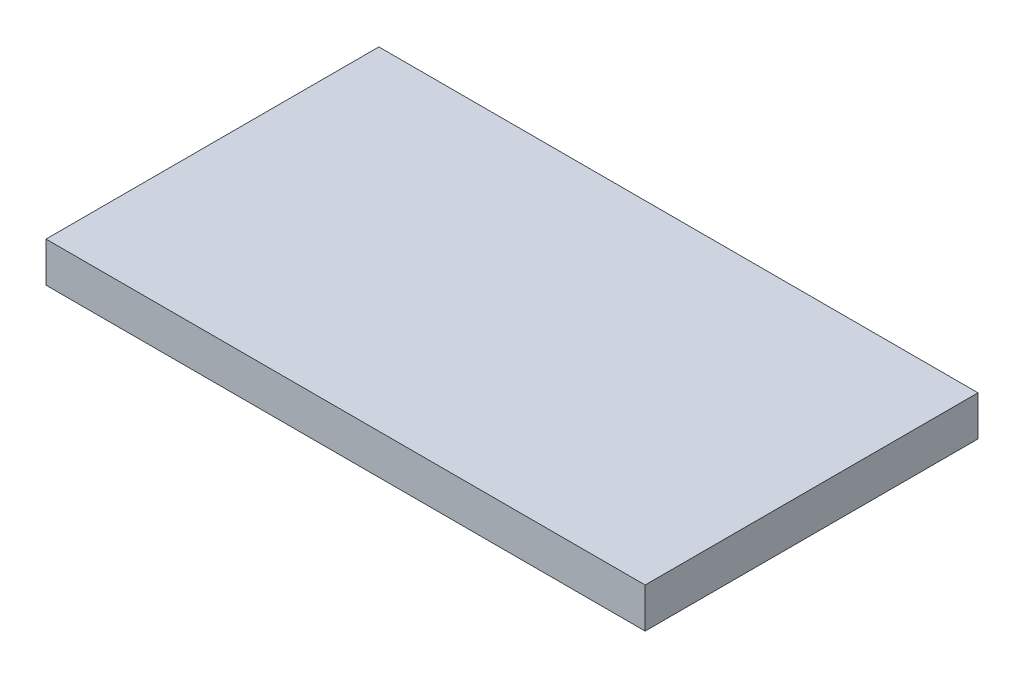
ISO-10303-21;
HEADER;
FILE_DESCRIPTION(('STEP AP214'),'2;1');
FILE_NAME('part.step','',(''),(''),'','','');
FILE_SCHEMA(('AUTOMOTIVE_DESIGN { 1 0 10303 214 1 1 1 1 }'));
ENDSEC;
DATA;
#1=APPLICATION_CONTEXT('core data for automotive mechanical design processes');
#2=APPLICATION_PROTOCOL_DEFINITION('international standard','automotive_design',2000,#1);
#3=PRODUCT_CONTEXT('',#1,'mechanical');
#4=PRODUCT('Part','Part','',(#3));
#5=PRODUCT_RELATED_PRODUCT_CATEGORY('part','',(#4));
#6=PRODUCT_DEFINITION_FORMATION('','',#4);
#7=PRODUCT_DEFINITION_CONTEXT('part definition',#1,'design');
#8=PRODUCT_DEFINITION('design','',#6,#7);
#9=PRODUCT_DEFINITION_SHAPE('','',#8);
#10=(LENGTH_UNIT() NAMED_UNIT(*) SI_UNIT(.MILLI.,.METRE.));
#11=(NAMED_UNIT(*) PLANE_ANGLE_UNIT() SI_UNIT($,.RADIAN.));
#12=(NAMED_UNIT(*) SI_UNIT($,.STERADIAN.) SOLID_ANGLE_UNIT());
#13=UNCERTAINTY_MEASURE_WITH_UNIT(LENGTH_MEASURE(1.E-05),#10,'distance_accuracy_value','');
#14=(GEOMETRIC_REPRESENTATION_CONTEXT(3) GLOBAL_UNCERTAINTY_ASSIGNED_CONTEXT((#13)) GLOBAL_UNIT_ASSIGNED_CONTEXT((#10,
#11,#12)) REPRESENTATION_CONTEXT('',''));
#15=CARTESIAN_POINT('',(0.,0.,0.));
#16=DIRECTION('',(0.,0.,1.));
#17=DIRECTION('',(1.,0.,0.));
#18=AXIS2_PLACEMENT_3D('',#15,#16,#17);
#19=CARTESIAN_POINT('',(22.5,1.5,-12.5));
#20=DIRECTION('',(-1.,0.,0.));
#21=DIRECTION('',(0.,0.,1.));
#22=AXIS2_PLACEMENT_3D('',#19,#20,#21);
#23=PLANE('',#22);
#24=DIRECTION('',(0.,0.,-1.));
#25=VECTOR('',#24,1.);
#26=CARTESIAN_POINT('',(22.5,-1.5,-12.5));
#27=LINE('',#26,#25);
#28=CARTESIAN_POINT('',(22.5,-1.5,12.5));
#29=VERTEX_POINT('',#28);
#30=CARTESIAN_POINT('',(22.5,-1.5,-12.5));
#31=VERTEX_POINT('',#30);
#32=EDGE_CURVE('E102',#29,#31,#27,.T.);
#33=ORIENTED_EDGE('',*,*,#32,.T.);
#34=DIRECTION('',(0.,-1.,0.));
#35=VECTOR('',#34,1.);
#36=CARTESIAN_POINT('',(22.5,1.5,-12.5));
#37=LINE('',#36,#35);
#38=CARTESIAN_POINT('',(22.5,1.5,-12.5));
#39=VERTEX_POINT('',#38);
#40=EDGE_CURVE('E11',#39,#31,#37,.T.);
#41=ORIENTED_EDGE('',*,*,#40,.F.);
#42=DIRECTION('',(0.,0.,-1.));
#43=VECTOR('',#42,1.);
#44=CARTESIAN_POINT('',(22.5,1.5,-12.5));
#45=LINE('',#44,#43);
#46=CARTESIAN_POINT('',(22.5,1.5,12.5));
#47=VERTEX_POINT('',#46);
#48=EDGE_CURVE('E90',#47,#39,#45,.T.);
#49=ORIENTED_EDGE('',*,*,#48,.F.);
#50=DIRECTION('',(0.,-1.,0.));
#51=VECTOR('',#50,1.);
#52=CARTESIAN_POINT('',(22.5,1.5,12.5));
#53=LINE('',#52,#51);
#54=EDGE_CURVE('E98',#47,#29,#53,.T.);
#55=ORIENTED_EDGE('',*,*,#54,.T.);
#56=EDGE_LOOP('',(#33,#41,#49,#55));
#57=FACE_BOUND('',#56,.T.);
#58=ADVANCED_FACE('F39',(#57),#23,.F.);
#59=CARTESIAN_POINT('',(-22.5,1.5,-12.5));
#60=DIRECTION('',(0.,0.,1.));
#61=DIRECTION('',(1.,0.,0.));
#62=AXIS2_PLACEMENT_3D('',#59,#60,#61);
#63=PLANE('',#62);
#64=DIRECTION('',(-1.,0.,0.));
#65=VECTOR('',#64,1.);
#66=CARTESIAN_POINT('',(-22.5,-1.5,-12.5));
#67=LINE('',#66,#65);
#68=CARTESIAN_POINT('',(-22.5,-1.5,-12.5));
#69=VERTEX_POINT('',#68);
#70=EDGE_CURVE('E94',#31,#69,#67,.T.);
#71=ORIENTED_EDGE('',*,*,#70,.T.);
#72=DIRECTION('',(0.,-1.,0.));
#73=VECTOR('',#72,1.);
#74=CARTESIAN_POINT('',(-22.5,1.5,-12.5));
#75=LINE('',#74,#73);
#76=CARTESIAN_POINT('',(-22.5,1.5,-12.5));
#77=VERTEX_POINT('',#76);
#78=EDGE_CURVE('E47',#77,#69,#75,.T.);
#79=ORIENTED_EDGE('',*,*,#78,.F.);
#80=DIRECTION('',(-1.,0.,0.));
#81=VECTOR('',#80,1.);
#82=CARTESIAN_POINT('',(-22.5,1.5,-12.5));
#83=LINE('',#82,#81);
#84=EDGE_CURVE('E85',#39,#77,#83,.T.);
#85=ORIENTED_EDGE('',*,*,#84,.F.);
#86=ORIENTED_EDGE('',*,*,#40,.T.);
#87=EDGE_LOOP('',(#71,#79,#85,#86));
#88=FACE_BOUND('',#87,.T.);
#89=ADVANCED_FACE('F93',(#88),#63,.F.);
#90=CARTESIAN_POINT('',(-22.5,1.5,-12.5));
#91=DIRECTION('',(1.,0.,0.));
#92=DIRECTION('',(0.,0.,-1.));
#93=AXIS2_PLACEMENT_3D('',#90,#91,#92);
#94=PLANE('',#93);
#95=DIRECTION('',(0.,0.,1.));
#96=VECTOR('',#95,1.);
#97=CARTESIAN_POINT('',(-22.5,-1.5,-12.5));
#98=LINE('',#97,#96);
#99=CARTESIAN_POINT('',(-22.5,-1.5,12.5));
#100=VERTEX_POINT('',#99);
#101=EDGE_CURVE('E72',#69,#100,#98,.T.);
#102=ORIENTED_EDGE('',*,*,#101,.T.);
#103=DIRECTION('',(0.,-1.,0.));
#104=VECTOR('',#103,1.);
#105=CARTESIAN_POINT('',(-22.5,1.5,12.5));
#106=LINE('',#105,#104);
#107=CARTESIAN_POINT('',(-22.5,1.5,12.5));
#108=VERTEX_POINT('',#107);
#109=EDGE_CURVE('E95',#108,#100,#106,.T.);
#110=ORIENTED_EDGE('',*,*,#109,.F.);
#111=DIRECTION('',(0.,0.,1.));
#112=VECTOR('',#111,1.);
#113=CARTESIAN_POINT('',(-22.5,1.5,-12.5));
#114=LINE('',#113,#112);
#115=EDGE_CURVE('E88',#77,#108,#114,.T.);
#116=ORIENTED_EDGE('',*,*,#115,.F.);
#117=ORIENTED_EDGE('',*,*,#78,.T.);
#118=EDGE_LOOP('',(#102,#110,#116,#117));
#119=FACE_BOUND('',#118,.T.);
#120=ADVANCED_FACE('F96',(#119),#94,.F.);
#121=CARTESIAN_POINT('',(-22.5,1.5,12.5));
#122=DIRECTION('',(0.,0.,-1.));
#123=DIRECTION('',(-1.,0.,0.));
#124=AXIS2_PLACEMENT_3D('',#121,#122,#123);
#125=PLANE('',#124);
#126=DIRECTION('',(1.,0.,0.));
#127=VECTOR('',#126,1.);
#128=CARTESIAN_POINT('',(-22.5,-1.5,12.5));
#129=LINE('',#128,#127);
#130=EDGE_CURVE('E78',#100,#29,#129,.T.);
#131=ORIENTED_EDGE('',*,*,#130,.T.);
#132=ORIENTED_EDGE('',*,*,#54,.F.);
#133=DIRECTION('',(1.,0.,0.));
#134=VECTOR('',#133,1.);
#135=CARTESIAN_POINT('',(-22.5,1.5,12.5));
#136=LINE('',#135,#134);
#137=EDGE_CURVE('E55',#108,#47,#136,.T.);
#138=ORIENTED_EDGE('',*,*,#137,.F.);
#139=ORIENTED_EDGE('',*,*,#109,.T.);
#140=EDGE_LOOP('',(#131,#132,#138,#139));
#141=FACE_BOUND('',#140,.T.);
#142=ADVANCED_FACE('F109',(#141),#125,.F.);
#143=CARTESIAN_POINT('',(0.,1.5,0.));
#144=DIRECTION('',(0.,1.,0.));
#145=DIRECTION('',(0.,0.,1.));
#146=AXIS2_PLACEMENT_3D('',#143,#144,#145);
#147=PLANE('',#146);
#148=ORIENTED_EDGE('',*,*,#48,.T.);
#149=ORIENTED_EDGE('',*,*,#84,.T.);
#150=ORIENTED_EDGE('',*,*,#115,.T.);
#151=ORIENTED_EDGE('',*,*,#137,.T.);
#152=EDGE_LOOP('',(#148,#149,#150,#151));
#153=FACE_BOUND('',#152,.T.);
#154=ADVANCED_FACE('F86',(#153),#147,.T.);
#155=CARTESIAN_POINT('',(0.,-1.5,0.));
#156=DIRECTION('',(0.,1.,0.));
#157=DIRECTION('',(0.,0.,1.));
#158=AXIS2_PLACEMENT_3D('',#155,#156,#157);
#159=PLANE('',#158);
#160=ORIENTED_EDGE('',*,*,#32,.F.);
#161=ORIENTED_EDGE('',*,*,#130,.F.);
#162=ORIENTED_EDGE('',*,*,#101,.F.);
#163=ORIENTED_EDGE('',*,*,#70,.F.);
#164=EDGE_LOOP('',(#160,#161,#162,#163));
#165=FACE_BOUND('',#164,.T.);
#166=ADVANCED_FACE('F112',(#165),#159,.F.);
#167=CLOSED_SHELL('',(#58,#89,#120,#142,#154,#166));
#168=MANIFOLD_SOLID_BREP('B2',#167);
#169=ADVANCED_BREP_SHAPE_REPRESENTATION('',(#18,#168),#14);
#170=SHAPE_DEFINITION_REPRESENTATION(#9,#169);
ENDSEC;
END-ISO-10303-21;
